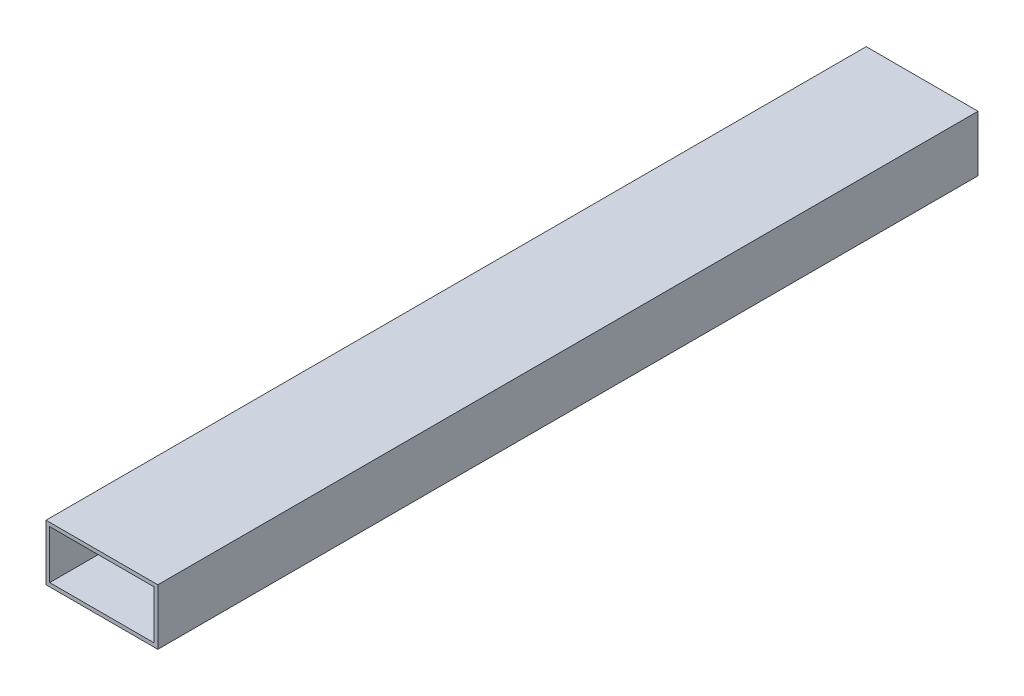
ISO-10303-21;
HEADER;
FILE_DESCRIPTION(('STEP AP214'),'2;1');
FILE_NAME('part.step','',(''),(''),'','','');
FILE_SCHEMA(('AUTOMOTIVE_DESIGN { 1 0 10303 214 1 1 1 1 }'));
ENDSEC;
DATA;
#1=APPLICATION_CONTEXT('core data for automotive mechanical design processes');
#2=APPLICATION_PROTOCOL_DEFINITION('international standard','automotive_design',2000,#1);
#3=PRODUCT_CONTEXT('',#1,'mechanical');
#4=PRODUCT('Part','Part','',(#3));
#5=PRODUCT_RELATED_PRODUCT_CATEGORY('part','',(#4));
#6=PRODUCT_DEFINITION_FORMATION('','',#4);
#7=PRODUCT_DEFINITION_CONTEXT('part definition',#1,'design');
#8=PRODUCT_DEFINITION('design','',#6,#7);
#9=PRODUCT_DEFINITION_SHAPE('','',#8);
#10=(LENGTH_UNIT() NAMED_UNIT(*) SI_UNIT(.MILLI.,.METRE.));
#11=(NAMED_UNIT(*) PLANE_ANGLE_UNIT() SI_UNIT($,.RADIAN.));
#12=(NAMED_UNIT(*) SI_UNIT($,.STERADIAN.) SOLID_ANGLE_UNIT());
#13=UNCERTAINTY_MEASURE_WITH_UNIT(LENGTH_MEASURE(1.E-05),#10,'distance_accuracy_value','');
#14=(GEOMETRIC_REPRESENTATION_CONTEXT(3) GLOBAL_UNCERTAINTY_ASSIGNED_CONTEXT((#13)) GLOBAL_UNIT_ASSIGNED_CONTEXT((#10,
#11,#12)) REPRESENTATION_CONTEXT('',''));
#15=CARTESIAN_POINT('',(0.,0.,0.));
#16=DIRECTION('',(0.,0.,1.));
#17=DIRECTION('',(1.,0.,0.));
#18=AXIS2_PLACEMENT_3D('',#15,#16,#17);
#19=CARTESIAN_POINT('',(0.,0.,220.));
#20=DIRECTION('',(0.,0.,-1.));
#21=DIRECTION('',(-1.,0.,0.));
#22=AXIS2_PLACEMENT_3D('',#19,#20,#21);
#23=PLANE('',#22);
#24=DIRECTION('',(0.,-1.,0.));
#25=VECTOR('',#24,1.);
#26=CARTESIAN_POINT('',(0.,0.,220.));
#27=LINE('',#26,#25);
#28=CARTESIAN_POINT('',(0.,15.,220.));
#29=VERTEX_POINT('',#28);
#30=CARTESIAN_POINT('',(0.,0.,220.));
#31=VERTEX_POINT('',#30);
#32=EDGE_CURVE('E142',#29,#31,#27,.T.);
#33=ORIENTED_EDGE('',*,*,#32,.T.);
#34=DIRECTION('',(1.,0.,0.));
#35=VECTOR('',#34,1.);
#36=CARTESIAN_POINT('',(0.,0.,220.));
#37=LINE('',#36,#35);
#38=CARTESIAN_POINT('',(30.,0.,220.));
#39=VERTEX_POINT('',#38);
#40=EDGE_CURVE('E145',#31,#39,#37,.T.);
#41=ORIENTED_EDGE('',*,*,#40,.T.);
#42=DIRECTION('',(0.,1.,0.));
#43=VECTOR('',#42,1.);
#44=CARTESIAN_POINT('',(30.,0.,220.));
#45=LINE('',#44,#43);
#46=CARTESIAN_POINT('',(30.,15.,220.));
#47=VERTEX_POINT('',#46);
#48=EDGE_CURVE('E148',#39,#47,#45,.T.);
#49=ORIENTED_EDGE('',*,*,#48,.T.);
#50=DIRECTION('',(-1.,0.,0.));
#51=VECTOR('',#50,1.);
#52=CARTESIAN_POINT('',(0.,15.,220.));
#53=LINE('',#52,#51);
#54=EDGE_CURVE('E150',#47,#29,#53,.T.);
#55=ORIENTED_EDGE('',*,*,#54,.T.);
#56=EDGE_LOOP('',(#33,#41,#49,#55));
#57=FACE_BOUND('',#56,.T.);
#58=DIRECTION('',(1.,0.,0.));
#59=VECTOR('',#58,1.);
#60=CARTESIAN_POINT('',(1.,1.,220.));
#61=LINE('',#60,#59);
#62=CARTESIAN_POINT('',(1.,1.,220.));
#63=VERTEX_POINT('',#62);
#64=CARTESIAN_POINT('',(29.,1.,220.));
#65=VERTEX_POINT('',#64);
#66=EDGE_CURVE('E106',#63,#65,#61,.T.);
#67=ORIENTED_EDGE('',*,*,#66,.F.);
#68=DIRECTION('',(0.,-1.,0.));
#69=VECTOR('',#68,1.);
#70=CARTESIAN_POINT('',(1.,1.,220.));
#71=LINE('',#70,#69);
#72=CARTESIAN_POINT('',(1.,14.,220.));
#73=VERTEX_POINT('',#72);
#74=EDGE_CURVE('E128',#73,#63,#71,.T.);
#75=ORIENTED_EDGE('',*,*,#74,.F.);
#76=DIRECTION('',(-1.,0.,0.));
#77=VECTOR('',#76,1.);
#78=CARTESIAN_POINT('',(1.,14.,220.));
#79=LINE('',#78,#77);
#80=CARTESIAN_POINT('',(29.,14.,220.));
#81=VERTEX_POINT('',#80);
#82=EDGE_CURVE('E126',#81,#73,#79,.T.);
#83=ORIENTED_EDGE('',*,*,#82,.F.);
#84=DIRECTION('',(0.,1.,0.));
#85=VECTOR('',#84,1.);
#86=CARTESIAN_POINT('',(29.,1.,220.));
#87=LINE('',#86,#85);
#88=EDGE_CURVE('E114',#65,#81,#87,.T.);
#89=ORIENTED_EDGE('',*,*,#88,.F.);
#90=EDGE_LOOP('',(#67,#75,#83,#89));
#91=FACE_BOUND('',#90,.T.);
#92=ADVANCED_FACE('F41',(#57,#91),#23,.F.);
#93=CARTESIAN_POINT('',(0.,0.,0.));
#94=DIRECTION('',(0.,0.,-1.));
#95=DIRECTION('',(-1.,0.,0.));
#96=AXIS2_PLACEMENT_3D('',#93,#94,#95);
#97=PLANE('',#96);
#98=DIRECTION('',(0.,-1.,0.));
#99=VECTOR('',#98,1.);
#100=CARTESIAN_POINT('',(0.,0.,0.));
#101=LINE('',#100,#99);
#102=CARTESIAN_POINT('',(0.,15.,0.));
#103=VERTEX_POINT('',#102);
#104=CARTESIAN_POINT('',(0.,0.,0.));
#105=VERTEX_POINT('',#104);
#106=EDGE_CURVE('E122',#103,#105,#101,.T.);
#107=ORIENTED_EDGE('',*,*,#106,.F.);
#108=DIRECTION('',(-1.,0.,0.));
#109=VECTOR('',#108,1.);
#110=CARTESIAN_POINT('',(0.,15.,0.));
#111=LINE('',#110,#109);
#112=CARTESIAN_POINT('',(30.,15.,0.));
#113=VERTEX_POINT('',#112);
#114=EDGE_CURVE('E146',#113,#103,#111,.T.);
#115=ORIENTED_EDGE('',*,*,#114,.F.);
#116=DIRECTION('',(0.,1.,0.));
#117=VECTOR('',#116,1.);
#118=CARTESIAN_POINT('',(30.,0.,0.));
#119=LINE('',#118,#117);
#120=CARTESIAN_POINT('',(30.,0.,0.));
#121=VERTEX_POINT('',#120);
#122=EDGE_CURVE('E157',#121,#113,#119,.T.);
#123=ORIENTED_EDGE('',*,*,#122,.F.);
#124=DIRECTION('',(1.,0.,0.));
#125=VECTOR('',#124,1.);
#126=CARTESIAN_POINT('',(0.,0.,0.));
#127=LINE('',#126,#125);
#128=EDGE_CURVE('E155',#105,#121,#127,.T.);
#129=ORIENTED_EDGE('',*,*,#128,.F.);
#130=EDGE_LOOP('',(#107,#115,#123,#129));
#131=FACE_BOUND('',#130,.T.);
#132=DIRECTION('',(0.,-1.,0.));
#133=VECTOR('',#132,1.);
#134=CARTESIAN_POINT('',(1.,1.,0.));
#135=LINE('',#134,#133);
#136=CARTESIAN_POINT('',(1.,14.,0.));
#137=VERTEX_POINT('',#136);
#138=CARTESIAN_POINT('',(1.,1.,0.));
#139=VERTEX_POINT('',#138);
#140=EDGE_CURVE('E115',#137,#139,#135,.T.);
#141=ORIENTED_EDGE('',*,*,#140,.T.);
#142=DIRECTION('',(1.,0.,0.));
#143=VECTOR('',#142,1.);
#144=CARTESIAN_POINT('',(1.,1.,0.));
#145=LINE('',#144,#143);
#146=CARTESIAN_POINT('',(29.,1.,0.));
#147=VERTEX_POINT('',#146);
#148=EDGE_CURVE('E64',#139,#147,#145,.T.);
#149=ORIENTED_EDGE('',*,*,#148,.T.);
#150=DIRECTION('',(0.,1.,0.));
#151=VECTOR('',#150,1.);
#152=CARTESIAN_POINT('',(29.,1.,0.));
#153=LINE('',#152,#151);
#154=CARTESIAN_POINT('',(29.,14.,0.));
#155=VERTEX_POINT('',#154);
#156=EDGE_CURVE('E121',#147,#155,#153,.T.);
#157=ORIENTED_EDGE('',*,*,#156,.T.);
#158=DIRECTION('',(-1.,0.,0.));
#159=VECTOR('',#158,1.);
#160=CARTESIAN_POINT('',(1.,14.,0.));
#161=LINE('',#160,#159);
#162=EDGE_CURVE('E134',#155,#137,#161,.T.);
#163=ORIENTED_EDGE('',*,*,#162,.T.);
#164=EDGE_LOOP('',(#141,#149,#157,#163));
#165=FACE_BOUND('',#164,.T.);
#166=ADVANCED_FACE('F175',(#131,#165),#97,.T.);
#167=CARTESIAN_POINT('',(0.,0.,220.));
#168=DIRECTION('',(1.,0.,0.));
#169=DIRECTION('',(0.,0.,-1.));
#170=AXIS2_PLACEMENT_3D('',#167,#168,#169);
#171=PLANE('',#170);
#172=ORIENTED_EDGE('',*,*,#106,.T.);
#173=DIRECTION('',(0.,0.,-1.));
#174=VECTOR('',#173,1.);
#175=CARTESIAN_POINT('',(0.,0.,220.));
#176=LINE('',#175,#174);
#177=EDGE_CURVE('E11',#31,#105,#176,.T.);
#178=ORIENTED_EDGE('',*,*,#177,.F.);
#179=ORIENTED_EDGE('',*,*,#32,.F.);
#180=DIRECTION('',(0.,0.,-1.));
#181=VECTOR('',#180,1.);
#182=CARTESIAN_POINT('',(0.,15.,220.));
#183=LINE('',#182,#181);
#184=EDGE_CURVE('E152',#29,#103,#183,.T.);
#185=ORIENTED_EDGE('',*,*,#184,.T.);
#186=EDGE_LOOP('',(#172,#178,#179,#185));
#187=FACE_BOUND('',#186,.T.);
#188=ADVANCED_FACE('F43',(#187),#171,.F.);
#189=CARTESIAN_POINT('',(0.,0.,220.));
#190=DIRECTION('',(0.,1.,0.));
#191=DIRECTION('',(0.,0.,1.));
#192=AXIS2_PLACEMENT_3D('',#189,#190,#191);
#193=PLANE('',#192);
#194=ORIENTED_EDGE('',*,*,#128,.T.);
#195=DIRECTION('',(0.,0.,-1.));
#196=VECTOR('',#195,1.);
#197=CARTESIAN_POINT('',(30.,0.,220.));
#198=LINE('',#197,#196);
#199=EDGE_CURVE('E49',#39,#121,#198,.T.);
#200=ORIENTED_EDGE('',*,*,#199,.F.);
#201=ORIENTED_EDGE('',*,*,#40,.F.);
#202=ORIENTED_EDGE('',*,*,#177,.T.);
#203=EDGE_LOOP('',(#194,#200,#201,#202));
#204=FACE_BOUND('',#203,.T.);
#205=ADVANCED_FACE('F185',(#204),#193,.F.);
#206=CARTESIAN_POINT('',(30.,0.,220.));
#207=DIRECTION('',(-1.,0.,0.));
#208=DIRECTION('',(0.,0.,1.));
#209=AXIS2_PLACEMENT_3D('',#206,#207,#208);
#210=PLANE('',#209);
#211=ORIENTED_EDGE('',*,*,#122,.T.);
#212=DIRECTION('',(0.,0.,-1.));
#213=VECTOR('',#212,1.);
#214=CARTESIAN_POINT('',(30.,15.,220.));
#215=LINE('',#214,#213);
#216=EDGE_CURVE('E162',#47,#113,#215,.T.);
#217=ORIENTED_EDGE('',*,*,#216,.F.);
#218=ORIENTED_EDGE('',*,*,#48,.F.);
#219=ORIENTED_EDGE('',*,*,#199,.T.);
#220=EDGE_LOOP('',(#211,#217,#218,#219));
#221=FACE_BOUND('',#220,.T.);
#222=ADVANCED_FACE('F169',(#221),#210,.F.);
#223=CARTESIAN_POINT('',(0.,15.,220.));
#224=DIRECTION('',(0.,-1.,0.));
#225=DIRECTION('',(0.,0.,-1.));
#226=AXIS2_PLACEMENT_3D('',#223,#224,#225);
#227=PLANE('',#226);
#228=ORIENTED_EDGE('',*,*,#114,.T.);
#229=ORIENTED_EDGE('',*,*,#184,.F.);
#230=ORIENTED_EDGE('',*,*,#54,.F.);
#231=ORIENTED_EDGE('',*,*,#216,.T.);
#232=EDGE_LOOP('',(#228,#229,#230,#231));
#233=FACE_BOUND('',#232,.T.);
#234=ADVANCED_FACE('F179',(#233),#227,.F.);
#235=CARTESIAN_POINT('',(1.,1.,220.));
#236=DIRECTION('',(0.,1.,0.));
#237=DIRECTION('',(0.,0.,1.));
#238=AXIS2_PLACEMENT_3D('',#235,#236,#237);
#239=PLANE('',#238);
#240=ORIENTED_EDGE('',*,*,#148,.F.);
#241=DIRECTION('',(0.,0.,-1.));
#242=VECTOR('',#241,1.);
#243=CARTESIAN_POINT('',(1.,1.,220.));
#244=LINE('',#243,#242);
#245=EDGE_CURVE('E110',#63,#139,#244,.T.);
#246=ORIENTED_EDGE('',*,*,#245,.F.);
#247=ORIENTED_EDGE('',*,*,#66,.T.);
#248=DIRECTION('',(0.,0.,-1.));
#249=VECTOR('',#248,1.);
#250=CARTESIAN_POINT('',(29.,1.,220.));
#251=LINE('',#250,#249);
#252=EDGE_CURVE('E109',#65,#147,#251,.T.);
#253=ORIENTED_EDGE('',*,*,#252,.T.);
#254=EDGE_LOOP('',(#240,#246,#247,#253));
#255=FACE_BOUND('',#254,.T.);
#256=ADVANCED_FACE('F108',(#255),#239,.T.);
#257=CARTESIAN_POINT('',(29.,1.,220.));
#258=DIRECTION('',(-1.,0.,0.));
#259=DIRECTION('',(0.,0.,1.));
#260=AXIS2_PLACEMENT_3D('',#257,#258,#259);
#261=PLANE('',#260);
#262=ORIENTED_EDGE('',*,*,#156,.F.);
#263=ORIENTED_EDGE('',*,*,#252,.F.);
#264=ORIENTED_EDGE('',*,*,#88,.T.);
#265=DIRECTION('',(0.,0.,-1.));
#266=VECTOR('',#265,1.);
#267=CARTESIAN_POINT('',(29.,14.,220.));
#268=LINE('',#267,#266);
#269=EDGE_CURVE('E123',#81,#155,#268,.T.);
#270=ORIENTED_EDGE('',*,*,#269,.T.);
#271=EDGE_LOOP('',(#262,#263,#264,#270));
#272=FACE_BOUND('',#271,.T.);
#273=ADVANCED_FACE('F118',(#272),#261,.T.);
#274=CARTESIAN_POINT('',(1.,14.,220.));
#275=DIRECTION('',(0.,-1.,0.));
#276=DIRECTION('',(0.,0.,-1.));
#277=AXIS2_PLACEMENT_3D('',#274,#275,#276);
#278=PLANE('',#277);
#279=ORIENTED_EDGE('',*,*,#162,.F.);
#280=ORIENTED_EDGE('',*,*,#269,.F.);
#281=ORIENTED_EDGE('',*,*,#82,.T.);
#282=DIRECTION('',(0.,0.,-1.));
#283=VECTOR('',#282,1.);
#284=CARTESIAN_POINT('',(1.,14.,220.));
#285=LINE('',#284,#283);
#286=EDGE_CURVE('E56',#73,#137,#285,.T.);
#287=ORIENTED_EDGE('',*,*,#286,.T.);
#288=EDGE_LOOP('',(#279,#280,#281,#287));
#289=FACE_BOUND('',#288,.T.);
#290=ADVANCED_FACE('F208',(#289),#278,.T.);
#291=CARTESIAN_POINT('',(1.,1.,220.));
#292=DIRECTION('',(1.,0.,0.));
#293=DIRECTION('',(0.,1.,0.));
#294=AXIS2_PLACEMENT_3D('',#291,#292,#293);
#295=PLANE('',#294);
#296=ORIENTED_EDGE('',*,*,#140,.F.);
#297=ORIENTED_EDGE('',*,*,#286,.F.);
#298=ORIENTED_EDGE('',*,*,#74,.T.);
#299=ORIENTED_EDGE('',*,*,#245,.T.);
#300=EDGE_LOOP('',(#296,#297,#298,#299));
#301=FACE_BOUND('',#300,.T.);
#302=ADVANCED_FACE('F212',(#301),#295,.T.);
#303=CLOSED_SHELL('',(#92,#166,#188,#205,#222,#234,#256,#273,#290,#302));
#304=MANIFOLD_SOLID_BREP('B2',#303);
#305=ADVANCED_BREP_SHAPE_REPRESENTATION('',(#18,#304),#14);
#306=SHAPE_DEFINITION_REPRESENTATION(#9,#305);
ENDSEC;
END-ISO-10303-21;
